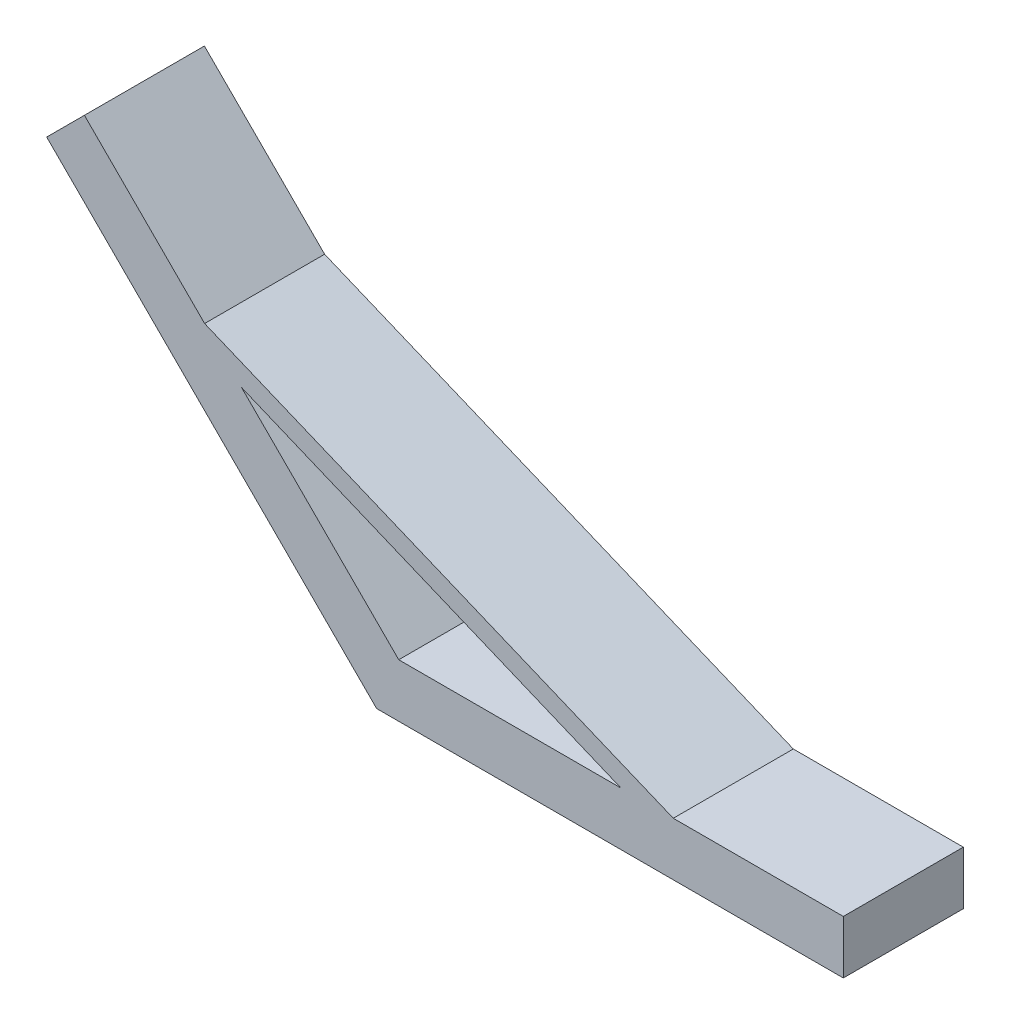
ISO-10303-21;
HEADER;
FILE_DESCRIPTION(('STEP AP214'),'2;1');
FILE_NAME('part.step','',(''),(''),'','','');
FILE_SCHEMA(('AUTOMOTIVE_DESIGN { 1 0 10303 214 1 1 1 1 }'));
ENDSEC;
DATA;
#1=APPLICATION_CONTEXT('core data for automotive mechanical design processes');
#2=APPLICATION_PROTOCOL_DEFINITION('international standard','automotive_design',2000,#1);
#3=PRODUCT_CONTEXT('',#1,'mechanical');
#4=PRODUCT('Part','Part','',(#3));
#5=PRODUCT_RELATED_PRODUCT_CATEGORY('part','',(#4));
#6=PRODUCT_DEFINITION_FORMATION('','',#4);
#7=PRODUCT_DEFINITION_CONTEXT('part definition',#1,'design');
#8=PRODUCT_DEFINITION('design','',#6,#7);
#9=PRODUCT_DEFINITION_SHAPE('','',#8);
#10=(LENGTH_UNIT() NAMED_UNIT(*) SI_UNIT(.MILLI.,.METRE.));
#11=(NAMED_UNIT(*) PLANE_ANGLE_UNIT() SI_UNIT($,.RADIAN.));
#12=(NAMED_UNIT(*) SI_UNIT($,.STERADIAN.) SOLID_ANGLE_UNIT());
#13=UNCERTAINTY_MEASURE_WITH_UNIT(LENGTH_MEASURE(1.E-05),#10,'distance_accuracy_value','');
#14=(GEOMETRIC_REPRESENTATION_CONTEXT(3) GLOBAL_UNCERTAINTY_ASSIGNED_CONTEXT((#13)) GLOBAL_UNIT_ASSIGNED_CONTEXT((#10,
#11,#12)) REPRESENTATION_CONTEXT('',''));
#15=CARTESIAN_POINT('',(0.,0.,0.));
#16=DIRECTION('',(0.,0.,1.));
#17=DIRECTION('',(1.,0.,0.));
#18=AXIS2_PLACEMENT_3D('',#15,#16,#17);
#19=CARTESIAN_POINT('',(8.1966991411008,19.7885822331376,18.));
#20=DIRECTION('',(0.382683432365087,0.923879532511288,0.));
#21=DIRECTION('',(-0.923879532511288,0.382683432365087,0.));
#22=AXIS2_PLACEMENT_3D('',#19,#20,#21);
#23=PLANE('',#22);
#24=DIRECTION('',(0.923879532511288,-0.382683432365087,0.));
#25=VECTOR('',#24,1.);
#26=CARTESIAN_POINT('',(8.1966991411008,19.7885822331376,0.));
#27=LINE('',#26,#25);
#28=CARTESIAN_POINT('',(-20.2634559672908,31.5771644662752,0.));
#29=VERTEX_POINT('',#28);
#30=CARTESIAN_POINT('',(36.6568542494924,8.,0.));
#31=VERTEX_POINT('',#30);
#32=EDGE_CURVE('E127',#29,#31,#27,.T.);
#33=ORIENTED_EDGE('',*,*,#32,.T.);
#34=DIRECTION('',(0.,0.,-1.));
#35=VECTOR('',#34,1.);
#36=CARTESIAN_POINT('',(36.6568542494924,8.,18.));
#37=LINE('',#36,#35);
#38=CARTESIAN_POINT('',(36.6568542494924,8.,18.));
#39=VERTEX_POINT('',#38);
#40=EDGE_CURVE('E11',#39,#31,#37,.T.);
#41=ORIENTED_EDGE('',*,*,#40,.F.);
#42=DIRECTION('',(0.923879532511288,-0.382683432365087,0.));
#43=VECTOR('',#42,1.);
#44=CARTESIAN_POINT('',(8.1966991411008,19.7885822331376,18.));
#45=LINE('',#44,#43);
#46=CARTESIAN_POINT('',(-20.2634559672908,31.5771644662752,18.));
#47=VERTEX_POINT('',#46);
#48=EDGE_CURVE('E119',#47,#39,#45,.T.);
#49=ORIENTED_EDGE('',*,*,#48,.F.);
#50=DIRECTION('',(0.,0.,-1.));
#51=VECTOR('',#50,1.);
#52=CARTESIAN_POINT('',(-20.2634559672908,31.5771644662752,18.));
#53=LINE('',#52,#51);
#54=EDGE_CURVE('E55',#47,#29,#53,.T.);
#55=ORIENTED_EDGE('',*,*,#54,.T.);
#56=EDGE_LOOP('',(#33,#41,#49,#55));
#57=FACE_BOUND('',#56,.T.);
#58=ADVANCED_FACE('F36',(#57),#23,.F.);
#59=CARTESIAN_POINT('',(0.,8.,18.));
#60=DIRECTION('',(0.,1.,0.));
#61=DIRECTION('',(0.,0.,1.));
#62=AXIS2_PLACEMENT_3D('',#59,#60,#61);
#63=PLANE('',#62);
#64=DIRECTION('',(1.,0.,0.));
#65=VECTOR('',#64,1.);
#66=CARTESIAN_POINT('',(0.,8.,0.));
#67=LINE('',#66,#65);
#68=CARTESIAN_POINT('',(3.31370849898473,8.,0.));
#69=VERTEX_POINT('',#68);
#70=EDGE_CURVE('E142',#69,#31,#67,.T.);
#71=ORIENTED_EDGE('',*,*,#70,.F.);
#72=DIRECTION('',(0.,0.,-1.));
#73=VECTOR('',#72,1.);
#74=CARTESIAN_POINT('',(3.31370849898473,8.,18.));
#75=LINE('',#74,#73);
#76=CARTESIAN_POINT('',(3.31370849898473,8.,18.));
#77=VERTEX_POINT('',#76);
#78=EDGE_CURVE('E46',#77,#69,#75,.T.);
#79=ORIENTED_EDGE('',*,*,#78,.F.);
#80=DIRECTION('',(1.,0.,0.));
#81=VECTOR('',#80,1.);
#82=CARTESIAN_POINT('',(0.,8.,18.));
#83=LINE('',#82,#81);
#84=EDGE_CURVE('E123',#77,#39,#83,.T.);
#85=ORIENTED_EDGE('',*,*,#84,.T.);
#86=ORIENTED_EDGE('',*,*,#40,.T.);
#87=EDGE_LOOP('',(#71,#79,#85,#86));
#88=FACE_BOUND('',#87,.T.);
#89=ADVANCED_FACE('F130',(#88),#63,.T.);
#90=CARTESIAN_POINT('',(44.4962320387507,8.,0.));
#91=VERTEX_POINT('',#90);
#92=CARTESIAN_POINT('',(70.,8.,0.));
#93=VERTEX_POINT('',#92);
#94=EDGE_CURVE('E147',#91,#93,#67,.T.);
#95=ORIENTED_EDGE('',*,*,#94,.F.);
#96=DIRECTION('',(0.,0.,-1.));
#97=VECTOR('',#96,1.);
#98=CARTESIAN_POINT('',(44.4962320387507,8.,18.));
#99=LINE('',#98,#97);
#100=CARTESIAN_POINT('',(44.4962320387507,8.,18.));
#101=VERTEX_POINT('',#100);
#102=EDGE_CURVE('E40',#101,#91,#99,.T.);
#103=ORIENTED_EDGE('',*,*,#102,.F.);
#104=CARTESIAN_POINT('',(70.,8.,18.));
#105=VERTEX_POINT('',#104);
#106=EDGE_CURVE('E132',#101,#105,#83,.T.);
#107=ORIENTED_EDGE('',*,*,#106,.T.);
#108=DIRECTION('',(0.,0.,-1.));
#109=VECTOR('',#108,1.);
#110=CARTESIAN_POINT('',(70.,8.,18.));
#111=LINE('',#110,#109);
#112=EDGE_CURVE('E133',#105,#93,#111,.T.);
#113=ORIENTED_EDGE('',*,*,#112,.T.);
#114=EDGE_LOOP('',(#95,#103,#107,#113));
#115=FACE_BOUND('',#114,.T.);
#116=ADVANCED_FACE('F227',(#115),#63,.T.);
#117=CARTESIAN_POINT('',(9.34474943819606,22.5602208306715,18.));
#118=DIRECTION('',(-0.382683432365087,-0.923879532511288,0.));
#119=DIRECTION('',(0.923879532511288,-0.382683432365087,0.));
#120=AXIS2_PLACEMENT_3D('',#117,#118,#119);
#121=PLANE('',#120);
#122=DIRECTION('',(-0.923879532511288,0.382683432365087,0.));
#123=VECTOR('',#122,1.);
#124=CARTESIAN_POINT('',(9.34474943819606,22.5602208306715,0.));
#125=LINE('',#124,#123);
#126=CARTESIAN_POINT('',(-25.8067331623585,37.1204416613429,0.));
#127=VERTEX_POINT('',#126);
#128=EDGE_CURVE('E152',#91,#127,#125,.T.);
#129=ORIENTED_EDGE('',*,*,#128,.T.);
#130=DIRECTION('',(0.,0.,-1.));
#131=VECTOR('',#130,1.);
#132=CARTESIAN_POINT('',(-25.8067331623585,37.1204416613429,18.));
#133=LINE('',#132,#131);
#134=CARTESIAN_POINT('',(-25.8067331623585,37.1204416613429,18.));
#135=VERTEX_POINT('',#134);
#136=EDGE_CURVE('E176',#135,#127,#133,.T.);
#137=ORIENTED_EDGE('',*,*,#136,.F.);
#138=DIRECTION('',(-0.923879532511288,0.382683432365087,0.));
#139=VECTOR('',#138,1.);
#140=CARTESIAN_POINT('',(9.34474943819606,22.5602208306715,18.));
#141=LINE('',#140,#139);
#142=EDGE_CURVE('E137',#101,#135,#141,.T.);
#143=ORIENTED_EDGE('',*,*,#142,.F.);
#144=ORIENTED_EDGE('',*,*,#102,.T.);
#145=EDGE_LOOP('',(#129,#137,#143,#144));
#146=FACE_BOUND('',#145,.T.);
#147=ADVANCED_FACE('F38',(#146),#121,.F.);
#148=CARTESIAN_POINT('',(5.65685424949235,5.65685424949241,18.));
#149=DIRECTION('',(0.707106781186543,0.707106781186552,0.));
#150=DIRECTION('',(-0.707106781186552,0.707106781186543,0.));
#151=AXIS2_PLACEMENT_3D('',#148,#149,#150);
#152=PLANE('',#151);
#153=DIRECTION('',(0.707106781186552,-0.707106781186543,0.));
#154=VECTOR('',#153,1.);
#155=CARTESIAN_POINT('',(5.65685424949235,5.65685424949241,0.));
#156=LINE('',#155,#154);
#157=CARTESIAN_POINT('',(-43.8406204335663,55.1543289325505,0.));
#158=VERTEX_POINT('',#157);
#159=EDGE_CURVE('E144',#158,#127,#156,.T.);
#160=ORIENTED_EDGE('',*,*,#159,.F.);
#161=DIRECTION('',(0.,0.,-1.));
#162=VECTOR('',#161,1.);
#163=CARTESIAN_POINT('',(-43.8406204335663,55.1543289325505,18.));
#164=LINE('',#163,#162);
#165=CARTESIAN_POINT('',(-43.8406204335663,55.1543289325505,18.));
#166=VERTEX_POINT('',#165);
#167=EDGE_CURVE('E177',#166,#158,#164,.T.);
#168=ORIENTED_EDGE('',*,*,#167,.F.);
#169=DIRECTION('',(0.707106781186552,-0.707106781186543,0.));
#170=VECTOR('',#169,1.);
#171=CARTESIAN_POINT('',(5.65685424949235,5.65685424949241,18.));
#172=LINE('',#171,#170);
#173=EDGE_CURVE('E135',#166,#135,#172,.T.);
#174=ORIENTED_EDGE('',*,*,#173,.T.);
#175=ORIENTED_EDGE('',*,*,#136,.T.);
#176=EDGE_LOOP('',(#160,#168,#174,#175));
#177=FACE_BOUND('',#176,.T.);
#178=ADVANCED_FACE('F175',(#177),#152,.T.);
#179=CARTESIAN_POINT('',(-49.4974746830586,49.497474683058,18.));
#180=DIRECTION('',(-0.707106781186552,0.707106781186543,0.));
#181=DIRECTION('',(-0.707106781186543,-0.707106781186552,0.));
#182=AXIS2_PLACEMENT_3D('',#179,#180,#181);
#183=PLANE('',#182);
#184=DIRECTION('',(0.707106781186543,0.707106781186552,0.));
#185=VECTOR('',#184,1.);
#186=CARTESIAN_POINT('',(-49.4974746830586,49.497474683058,0.));
#187=LINE('',#186,#185);
#188=CARTESIAN_POINT('',(-49.4974746830586,49.497474683058,0.));
#189=VERTEX_POINT('',#188);
#190=EDGE_CURVE('E151',#189,#158,#187,.T.);
#191=ORIENTED_EDGE('',*,*,#190,.F.);
#192=DIRECTION('',(0.,0.,-1.));
#193=VECTOR('',#192,1.);
#194=CARTESIAN_POINT('',(-49.4974746830586,49.497474683058,18.));
#195=LINE('',#194,#193);
#196=CARTESIAN_POINT('',(-49.4974746830586,49.497474683058,18.));
#197=VERTEX_POINT('',#196);
#198=EDGE_CURVE('E184',#197,#189,#195,.T.);
#199=ORIENTED_EDGE('',*,*,#198,.F.);
#200=DIRECTION('',(0.707106781186543,0.707106781186552,0.));
#201=VECTOR('',#200,1.);
#202=CARTESIAN_POINT('',(-49.4974746830586,49.497474683058,18.));
#203=LINE('',#202,#201);
#204=EDGE_CURVE('E170',#197,#166,#203,.T.);
#205=ORIENTED_EDGE('',*,*,#204,.T.);
#206=ORIENTED_EDGE('',*,*,#167,.T.);
#207=EDGE_LOOP('',(#191,#199,#205,#206));
#208=FACE_BOUND('',#207,.T.);
#209=ADVANCED_FACE('F183',(#208),#183,.T.);
#210=CARTESIAN_POINT('',(0.,0.,18.));
#211=DIRECTION('',(-0.707106781186543,-0.707106781186552,0.));
#212=DIRECTION('',(0.707106781186552,-0.707106781186543,0.));
#213=AXIS2_PLACEMENT_3D('',#210,#211,#212);
#214=PLANE('',#213);
#215=DIRECTION('',(-0.707106781186552,0.707106781186544,0.));
#216=VECTOR('',#215,1.);
#217=CARTESIAN_POINT('',(0.,0.,0.));
#218=LINE('',#217,#216);
#219=CARTESIAN_POINT('',(0.,0.,0.));
#220=VERTEX_POINT('',#219);
#221=EDGE_CURVE('E157',#220,#189,#218,.T.);
#222=ORIENTED_EDGE('',*,*,#221,.F.);
#223=DIRECTION('',(0.,0.,-1.));
#224=VECTOR('',#223,1.);
#225=CARTESIAN_POINT('',(0.,0.,18.));
#226=LINE('',#225,#224);
#227=CARTESIAN_POINT('',(0.,0.,18.));
#228=VERTEX_POINT('',#227);
#229=EDGE_CURVE('E188',#228,#220,#226,.T.);
#230=ORIENTED_EDGE('',*,*,#229,.F.);
#231=DIRECTION('',(-0.707106781186552,0.707106781186544,0.));
#232=VECTOR('',#231,1.);
#233=CARTESIAN_POINT('',(0.,0.,18.));
#234=LINE('',#233,#232);
#235=EDGE_CURVE('E167',#228,#197,#234,.T.);
#236=ORIENTED_EDGE('',*,*,#235,.T.);
#237=ORIENTED_EDGE('',*,*,#198,.T.);
#238=EDGE_LOOP('',(#222,#230,#236,#237));
#239=FACE_BOUND('',#238,.T.);
#240=ADVANCED_FACE('F214',(#239),#214,.T.);
#241=CARTESIAN_POINT('',(0.,0.,18.));
#242=DIRECTION('',(0.,1.,0.));
#243=DIRECTION('',(0.,0.,1.));
#244=AXIS2_PLACEMENT_3D('',#241,#242,#243);
#245=PLANE('',#244);
#246=DIRECTION('',(1.,0.,0.));
#247=VECTOR('',#246,1.);
#248=CARTESIAN_POINT('',(0.,0.,0.));
#249=LINE('',#248,#247);
#250=CARTESIAN_POINT('',(70.,0.,0.));
#251=VERTEX_POINT('',#250);
#252=EDGE_CURVE('E209',#220,#251,#249,.T.);
#253=ORIENTED_EDGE('',*,*,#252,.T.);
#254=DIRECTION('',(0.,0.,-1.));
#255=VECTOR('',#254,1.);
#256=CARTESIAN_POINT('',(70.,0.,18.));
#257=LINE('',#256,#255);
#258=CARTESIAN_POINT('',(70.,0.,18.));
#259=VERTEX_POINT('',#258);
#260=EDGE_CURVE('E191',#259,#251,#257,.T.);
#261=ORIENTED_EDGE('',*,*,#260,.F.);
#262=DIRECTION('',(1.,0.,0.));
#263=VECTOR('',#262,1.);
#264=CARTESIAN_POINT('',(0.,0.,18.));
#265=LINE('',#264,#263);
#266=EDGE_CURVE('E165',#228,#259,#265,.T.);
#267=ORIENTED_EDGE('',*,*,#266,.F.);
#268=ORIENTED_EDGE('',*,*,#229,.T.);
#269=EDGE_LOOP('',(#253,#261,#267,#268));
#270=FACE_BOUND('',#269,.T.);
#271=ADVANCED_FACE('F210',(#270),#245,.F.);
#272=CARTESIAN_POINT('',(70.,0.,18.));
#273=DIRECTION('',(1.,0.,0.));
#274=DIRECTION('',(0.,0.,-1.));
#275=AXIS2_PLACEMENT_3D('',#272,#273,#274);
#276=PLANE('',#275);
#277=DIRECTION('',(0.,-1.,0.));
#278=VECTOR('',#277,1.);
#279=CARTESIAN_POINT('',(70.,0.,0.));
#280=LINE('',#279,#278);
#281=EDGE_CURVE('E205',#93,#251,#280,.T.);
#282=ORIENTED_EDGE('',*,*,#281,.F.);
#283=ORIENTED_EDGE('',*,*,#112,.F.);
#284=DIRECTION('',(0.,-1.,0.));
#285=VECTOR('',#284,1.);
#286=CARTESIAN_POINT('',(70.,0.,18.));
#287=LINE('',#286,#285);
#288=EDGE_CURVE('E125',#105,#259,#287,.T.);
#289=ORIENTED_EDGE('',*,*,#288,.T.);
#290=ORIENTED_EDGE('',*,*,#260,.T.);
#291=EDGE_LOOP('',(#282,#283,#289,#290));
#292=FACE_BOUND('',#291,.T.);
#293=ADVANCED_FACE('F203',(#292),#276,.T.);
#294=EDGE_CURVE('E138',#29,#69,#156,.T.);
#295=ORIENTED_EDGE('',*,*,#294,.F.);
#296=ORIENTED_EDGE('',*,*,#54,.F.);
#297=EDGE_CURVE('E124',#47,#77,#172,.T.);
#298=ORIENTED_EDGE('',*,*,#297,.T.);
#299=ORIENTED_EDGE('',*,*,#78,.T.);
#300=EDGE_LOOP('',(#295,#296,#298,#299));
#301=FACE_BOUND('',#300,.T.);
#302=ADVANCED_FACE('F232',(#301),#152,.T.);
#303=CARTESIAN_POINT('',(0.,0.,18.));
#304=DIRECTION('',(0.,0.,1.));
#305=DIRECTION('',(1.,0.,0.));
#306=AXIS2_PLACEMENT_3D('',#303,#304,#305);
#307=PLANE('',#306);
#308=ORIENTED_EDGE('',*,*,#106,.F.);
#309=ORIENTED_EDGE('',*,*,#142,.T.);
#310=ORIENTED_EDGE('',*,*,#173,.F.);
#311=ORIENTED_EDGE('',*,*,#204,.F.);
#312=ORIENTED_EDGE('',*,*,#235,.F.);
#313=ORIENTED_EDGE('',*,*,#266,.T.);
#314=ORIENTED_EDGE('',*,*,#288,.F.);
#315=EDGE_LOOP('',(#308,#309,#310,#311,#312,#313,#314));
#316=FACE_BOUND('',#315,.T.);
#317=ORIENTED_EDGE('',*,*,#48,.T.);
#318=ORIENTED_EDGE('',*,*,#84,.F.);
#319=ORIENTED_EDGE('',*,*,#297,.F.);
#320=EDGE_LOOP('',(#317,#318,#319));
#321=FACE_BOUND('',#320,.T.);
#322=ADVANCED_FACE('F121',(#316,#321),#307,.T.);
#323=CARTESIAN_POINT('',(0.,0.,0.));
#324=DIRECTION('',(0.,0.,1.));
#325=DIRECTION('',(1.,0.,0.));
#326=AXIS2_PLACEMENT_3D('',#323,#324,#325);
#327=PLANE('',#326);
#328=ORIENTED_EDGE('',*,*,#94,.T.);
#329=ORIENTED_EDGE('',*,*,#281,.T.);
#330=ORIENTED_EDGE('',*,*,#252,.F.);
#331=ORIENTED_EDGE('',*,*,#221,.T.);
#332=ORIENTED_EDGE('',*,*,#190,.T.);
#333=ORIENTED_EDGE('',*,*,#159,.T.);
#334=ORIENTED_EDGE('',*,*,#128,.F.);
#335=EDGE_LOOP('',(#328,#329,#330,#331,#332,#333,#334));
#336=FACE_BOUND('',#335,.T.);
#337=ORIENTED_EDGE('',*,*,#32,.F.);
#338=ORIENTED_EDGE('',*,*,#294,.T.);
#339=ORIENTED_EDGE('',*,*,#70,.T.);
#340=EDGE_LOOP('',(#337,#338,#339));
#341=FACE_BOUND('',#340,.T.);
#342=ADVANCED_FACE('F212',(#336,#341),#327,.F.);
#343=CLOSED_SHELL('',(#58,#89,#116,#147,#178,#209,#240,#271,#293,#302,#322,#342));
#344=MANIFOLD_SOLID_BREP('B2',#343);
#345=ADVANCED_BREP_SHAPE_REPRESENTATION('',(#18,#344),#14);
#346=SHAPE_DEFINITION_REPRESENTATION(#9,#345);
ENDSEC;
END-ISO-10303-21;
